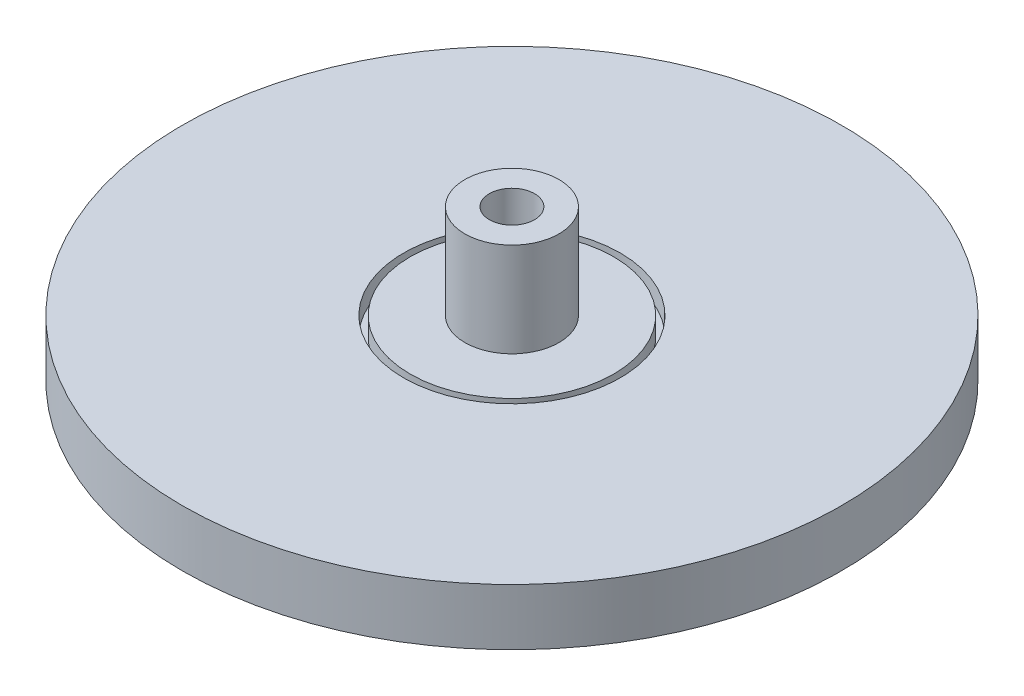
ISO-10303-21;
HEADER;
FILE_DESCRIPTION(('STEP AP214'),'2;1');
FILE_NAME('part.step','',(''),(''),'','','');
FILE_SCHEMA(('AUTOMOTIVE_DESIGN { 1 0 10303 214 1 1 1 1 }'));
ENDSEC;
DATA;
#1=APPLICATION_CONTEXT('core data for automotive mechanical design processes');
#2=APPLICATION_PROTOCOL_DEFINITION('international standard','automotive_design',2000,#1);
#3=PRODUCT_CONTEXT('',#1,'mechanical');
#4=PRODUCT('Part','Part','',(#3));
#5=PRODUCT_RELATED_PRODUCT_CATEGORY('part','',(#4));
#6=PRODUCT_DEFINITION_FORMATION('','',#4);
#7=PRODUCT_DEFINITION_CONTEXT('part definition',#1,'design');
#8=PRODUCT_DEFINITION('design','',#6,#7);
#9=PRODUCT_DEFINITION_SHAPE('','',#8);
#10=(LENGTH_UNIT() NAMED_UNIT(*) SI_UNIT(.MILLI.,.METRE.));
#11=(NAMED_UNIT(*) PLANE_ANGLE_UNIT() SI_UNIT($,.RADIAN.));
#12=(NAMED_UNIT(*) SI_UNIT($,.STERADIAN.) SOLID_ANGLE_UNIT());
#13=UNCERTAINTY_MEASURE_WITH_UNIT(LENGTH_MEASURE(1.E-05),#10,'distance_accuracy_value','');
#14=(GEOMETRIC_REPRESENTATION_CONTEXT(3) GLOBAL_UNCERTAINTY_ASSIGNED_CONTEXT((#13)) GLOBAL_UNIT_ASSIGNED_CONTEXT((#10,
#11,#12)) REPRESENTATION_CONTEXT('',''));
#15=CARTESIAN_POINT('',(0.,0.,0.));
#16=DIRECTION('',(0.,0.,1.));
#17=DIRECTION('',(1.,0.,0.));
#18=AXIS2_PLACEMENT_3D('',#15,#16,#17);
#19=CARTESIAN_POINT('',(0.,30.,0.));
#20=DIRECTION('',(0.,1.,0.));
#21=DIRECTION('',(0.,0.,1.));
#22=AXIS2_PLACEMENT_3D('',#19,#20,#21);
#23=PLANE('',#22);
#24=CARTESIAN_POINT('',(0.,30.,0.));
#25=DIRECTION('',(0.,1.,0.));
#26=DIRECTION('',(0.,0.,1.));
#27=AXIS2_PLACEMENT_3D('',#24,#25,#26);
#28=CIRCLE('',#27,25.);
#29=CARTESIAN_POINT('',(0.,30.,25.));
#30=VERTEX_POINT('',#29);
#31=EDGE_CURVE('E57',#30,#30,#28,.T.);
#32=ORIENTED_EDGE('',*,*,#31,.F.);
#33=EDGE_LOOP('',(#32));
#34=FACE_BOUND('',#33,.T.);
#35=CARTESIAN_POINT('',(0.,30.,0.));
#36=DIRECTION('',(0.,1.,0.));
#37=DIRECTION('',(0.,0.,1.));
#38=AXIS2_PLACEMENT_3D('',#35,#36,#37);
#39=CIRCLE('',#38,54.);
#40=CARTESIAN_POINT('',(0.,30.,54.));
#41=VERTEX_POINT('',#40);
#42=EDGE_CURVE('E77',#41,#41,#39,.T.);
#43=ORIENTED_EDGE('',*,*,#42,.T.);
#44=EDGE_LOOP('',(#43));
#45=FACE_BOUND('',#44,.T.);
#46=ADVANCED_FACE('F36',(#34,#45),#23,.T.);
#47=CARTESIAN_POINT('',(0.,80.,0.));
#48=DIRECTION('',(0.,1.,0.));
#49=DIRECTION('',(0.,0.,1.));
#50=AXIS2_PLACEMENT_3D('',#47,#48,#49);
#51=PLANE('',#50);
#52=CARTESIAN_POINT('',(0.,80.,0.));
#53=DIRECTION('',(0.,1.,0.));
#54=DIRECTION('',(0.,0.,1.));
#55=AXIS2_PLACEMENT_3D('',#52,#53,#54);
#56=CIRCLE('',#55,25.);
#57=CARTESIAN_POINT('',(0.,80.,25.));
#58=VERTEX_POINT('',#57);
#59=EDGE_CURVE('E55',#58,#58,#56,.T.);
#60=ORIENTED_EDGE('',*,*,#59,.T.);
#61=EDGE_LOOP('',(#60));
#62=FACE_BOUND('',#61,.T.);
#63=CARTESIAN_POINT('',(0.,80.,0.));
#64=DIRECTION('',(0.,1.,0.));
#65=DIRECTION('',(0.,0.,1.));
#66=AXIS2_PLACEMENT_3D('',#63,#64,#65);
#67=CIRCLE('',#66,12.);
#68=CARTESIAN_POINT('',(0.,80.,12.));
#69=VERTEX_POINT('',#68);
#70=EDGE_CURVE('E61',#69,#69,#67,.T.);
#71=ORIENTED_EDGE('',*,*,#70,.F.);
#72=EDGE_LOOP('',(#71));
#73=FACE_BOUND('',#72,.T.);
#74=ADVANCED_FACE('F112',(#62,#73),#51,.T.);
#75=CARTESIAN_POINT('',(0.,80.,0.));
#76=DIRECTION('',(0.,-1.,0.));
#77=DIRECTION('',(0.,0.,-1.));
#78=AXIS2_PLACEMENT_3D('',#75,#76,#77);
#79=CYLINDRICAL_SURFACE('',#78,25.);
#80=ORIENTED_EDGE('',*,*,#59,.F.);
#81=EDGE_LOOP('',(#80));
#82=FACE_BOUND('',#81,.T.);
#83=ORIENTED_EDGE('',*,*,#31,.T.);
#84=EDGE_LOOP('',(#83));
#85=FACE_BOUND('',#84,.T.);
#86=ADVANCED_FACE('F121',(#82,#85),#79,.T.);
#87=CARTESIAN_POINT('',(0.,80.,0.));
#88=DIRECTION('',(0.,-1.,0.));
#89=DIRECTION('',(0.,0.,-1.));
#90=AXIS2_PLACEMENT_3D('',#87,#88,#89);
#91=CYLINDRICAL_SURFACE('',#90,12.);
#92=ORIENTED_EDGE('',*,*,#70,.T.);
#93=EDGE_LOOP('',(#92));
#94=FACE_BOUND('',#93,.T.);
#95=CARTESIAN_POINT('',(0.,30.,0.));
#96=DIRECTION('',(0.,1.,0.));
#97=DIRECTION('',(0.,0.,1.));
#98=AXIS2_PLACEMENT_3D('',#95,#96,#97);
#99=CIRCLE('',#98,12.);
#100=CARTESIAN_POINT('',(0.,30.,12.));
#101=VERTEX_POINT('',#100);
#102=EDGE_CURVE('E10',#101,#101,#99,.F.);
#103=ORIENTED_EDGE('',*,*,#102,.T.);
#104=EDGE_LOOP('',(#103));
#105=FACE_BOUND('',#104,.T.);
#106=ADVANCED_FACE('F115',(#94,#105),#91,.F.);
#107=ORIENTED_EDGE('',*,*,#102,.F.);
#108=EDGE_LOOP('',(#107));
#109=FACE_BOUND('',#108,.T.);
#110=ADVANCED_FACE('F97',(#109),#23,.T.);
#111=CARTESIAN_POINT('',(0.,20.,0.));
#112=DIRECTION('',(0.,1.,0.));
#113=DIRECTION('',(0.,0.,1.));
#114=AXIS2_PLACEMENT_3D('',#111,#112,#113);
#115=CYLINDRICAL_SURFACE('',#114,57.5);
#116=CARTESIAN_POINT('',(0.,20.,0.));
#117=DIRECTION('',(0.,1.,0.));
#118=DIRECTION('',(0.,0.,1.));
#119=AXIS2_PLACEMENT_3D('',#116,#117,#118);
#120=CIRCLE('',#119,57.5);
#121=CARTESIAN_POINT('',(0.,20.,57.5));
#122=VERTEX_POINT('',#121);
#123=EDGE_CURVE('E68',#122,#122,#120,.T.);
#124=ORIENTED_EDGE('',*,*,#123,.F.);
#125=EDGE_LOOP('',(#124));
#126=FACE_BOUND('',#125,.T.);
#127=CARTESIAN_POINT('',(0.,30.,0.));
#128=DIRECTION('',(0.,1.,0.));
#129=DIRECTION('',(0.,0.,1.));
#130=AXIS2_PLACEMENT_3D('',#127,#128,#129);
#131=CIRCLE('',#130,57.5);
#132=CARTESIAN_POINT('',(0.,30.,57.5));
#133=VERTEX_POINT('',#132);
#134=EDGE_CURVE('E69',#133,#133,#131,.T.);
#135=ORIENTED_EDGE('',*,*,#134,.T.);
#136=EDGE_LOOP('',(#135));
#137=FACE_BOUND('',#136,.T.);
#138=ADVANCED_FACE('F91',(#126,#137),#115,.F.);
#139=CARTESIAN_POINT('',(0.,20.,0.));
#140=DIRECTION('',(0.,1.,0.));
#141=DIRECTION('',(0.,0.,1.));
#142=AXIS2_PLACEMENT_3D('',#139,#140,#141);
#143=PLANE('',#142);
#144=CARTESIAN_POINT('',(0.,20.,0.));
#145=DIRECTION('',(0.,1.,0.));
#146=DIRECTION('',(0.,0.,1.));
#147=AXIS2_PLACEMENT_3D('',#144,#145,#146);
#148=CIRCLE('',#147,54.);
#149=CARTESIAN_POINT('',(0.,20.,54.));
#150=VERTEX_POINT('',#149);
#151=EDGE_CURVE('E73',#150,#150,#148,.T.);
#152=ORIENTED_EDGE('',*,*,#151,.F.);
#153=EDGE_LOOP('',(#152));
#154=FACE_BOUND('',#153,.T.);
#155=ORIENTED_EDGE('',*,*,#123,.T.);
#156=EDGE_LOOP('',(#155));
#157=FACE_BOUND('',#156,.T.);
#158=ADVANCED_FACE('F88',(#154,#157),#143,.T.);
#159=CARTESIAN_POINT('',(0.,20.,0.));
#160=DIRECTION('',(0.,1.,0.));
#161=DIRECTION('',(0.,0.,1.));
#162=AXIS2_PLACEMENT_3D('',#159,#160,#161);
#163=CYLINDRICAL_SURFACE('',#162,54.);
#164=ORIENTED_EDGE('',*,*,#151,.T.);
#165=EDGE_LOOP('',(#164));
#166=FACE_BOUND('',#165,.T.);
#167=ORIENTED_EDGE('',*,*,#42,.F.);
#168=EDGE_LOOP('',(#167));
#169=FACE_BOUND('',#168,.T.);
#170=ADVANCED_FACE('F85',(#166,#169),#163,.T.);
#171=CARTESIAN_POINT('',(0.,0.,0.));
#172=DIRECTION('',(0.,1.,0.));
#173=DIRECTION('',(0.,0.,1.));
#174=AXIS2_PLACEMENT_3D('',#171,#172,#173);
#175=PLANE('',#174);
#176=CARTESIAN_POINT('',(0.,0.,0.));
#177=DIRECTION('',(0.,1.,0.));
#178=DIRECTION('',(0.,0.,1.));
#179=AXIS2_PLACEMENT_3D('',#176,#177,#178);
#180=CIRCLE('',#179,175.);
#181=CARTESIAN_POINT('',(0.,0.,175.));
#182=VERTEX_POINT('',#181);
#183=EDGE_CURVE('E49',#182,#182,#180,.T.);
#184=ORIENTED_EDGE('',*,*,#183,.F.);
#185=EDGE_LOOP('',(#184));
#186=FACE_BOUND('',#185,.T.);
#187=ADVANCED_FACE('F108',(#186),#175,.F.);
#188=CARTESIAN_POINT('',(0.,30.,0.));
#189=DIRECTION('',(0.,-1.,0.));
#190=DIRECTION('',(0.,0.,-1.));
#191=AXIS2_PLACEMENT_3D('',#188,#189,#190);
#192=CYLINDRICAL_SURFACE('',#191,175.);
#193=CARTESIAN_POINT('',(0.,30.,0.));
#194=DIRECTION('',(0.,1.,0.));
#195=DIRECTION('',(0.,0.,1.));
#196=AXIS2_PLACEMENT_3D('',#193,#194,#195);
#197=CIRCLE('',#196,175.);
#198=CARTESIAN_POINT('',(0.,30.,175.));
#199=VERTEX_POINT('',#198);
#200=EDGE_CURVE('E44',#199,#199,#197,.T.);
#201=ORIENTED_EDGE('',*,*,#200,.F.);
#202=EDGE_LOOP('',(#201));
#203=FACE_BOUND('',#202,.T.);
#204=ORIENTED_EDGE('',*,*,#183,.T.);
#205=EDGE_LOOP('',(#204));
#206=FACE_BOUND('',#205,.T.);
#207=ADVANCED_FACE('F38',(#203,#206),#192,.T.);
#208=ORIENTED_EDGE('',*,*,#134,.F.);
#209=EDGE_LOOP('',(#208));
#210=FACE_BOUND('',#209,.T.);
#211=ORIENTED_EDGE('',*,*,#200,.T.);
#212=EDGE_LOOP('',(#211));
#213=FACE_BOUND('',#212,.T.);
#214=ADVANCED_FACE('F101',(#210,#213),#23,.T.);
#215=CLOSED_SHELL('',(#46,#74,#86,#106,#110,#138,#158,#170,#187,#207,#214));
#216=MANIFOLD_SOLID_BREP('B2',#215);
#217=ADVANCED_BREP_SHAPE_REPRESENTATION('',(#18,#216),#14);
#218=SHAPE_DEFINITION_REPRESENTATION(#9,#217);
ENDSEC;
END-ISO-10303-21;
